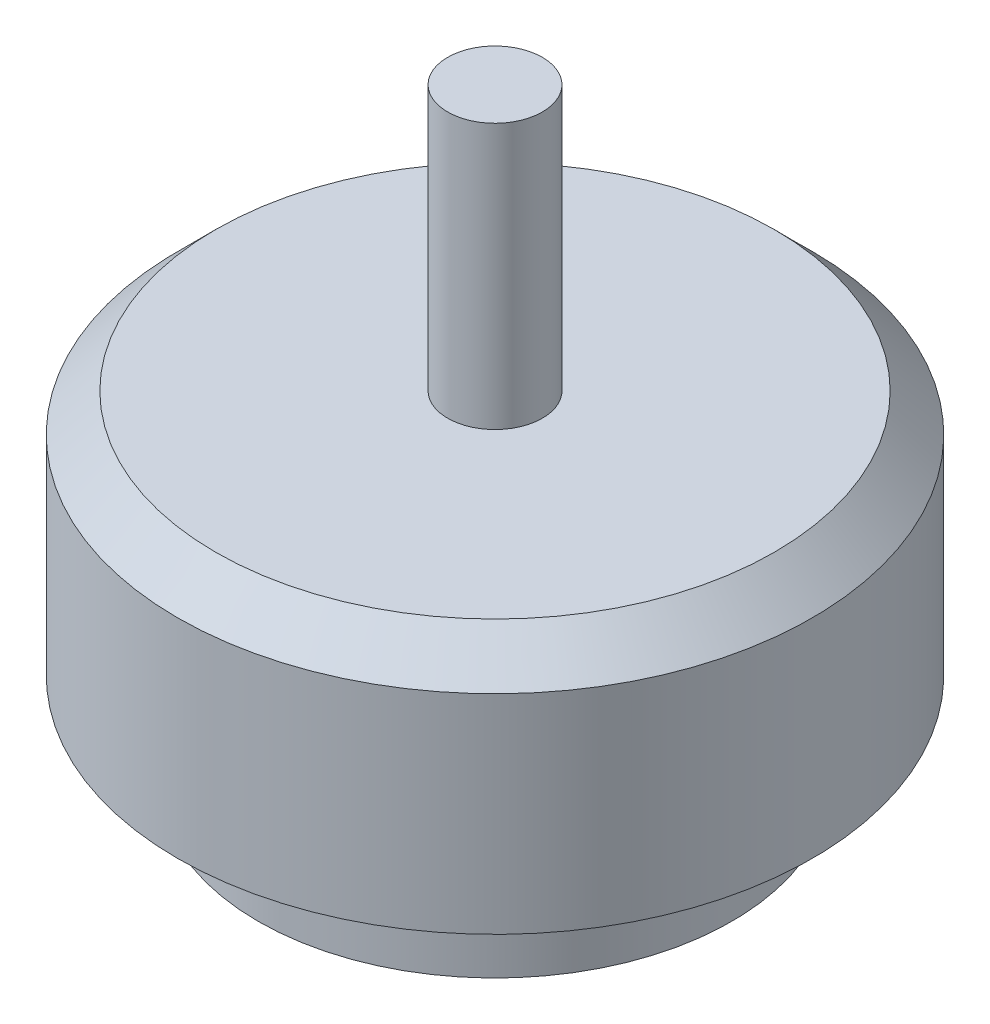
ISO-10303-21;
HEADER;
FILE_DESCRIPTION(('STEP AP214'),'2;1');
FILE_NAME('part.step','',(''),(''),'','','');
FILE_SCHEMA(('AUTOMOTIVE_DESIGN { 1 0 10303 214 1 1 1 1 }'));
ENDSEC;
DATA;
#1=APPLICATION_CONTEXT('core data for automotive mechanical design processes');
#2=APPLICATION_PROTOCOL_DEFINITION('international standard','automotive_design',2000,#1);
#3=PRODUCT_CONTEXT('',#1,'mechanical');
#4=PRODUCT('Part','Part','',(#3));
#5=PRODUCT_RELATED_PRODUCT_CATEGORY('part','',(#4));
#6=PRODUCT_DEFINITION_FORMATION('','',#4);
#7=PRODUCT_DEFINITION_CONTEXT('part definition',#1,'design');
#8=PRODUCT_DEFINITION('design','',#6,#7);
#9=PRODUCT_DEFINITION_SHAPE('','',#8);
#10=(LENGTH_UNIT() NAMED_UNIT(*) SI_UNIT(.MILLI.,.METRE.));
#11=(NAMED_UNIT(*) PLANE_ANGLE_UNIT() SI_UNIT($,.RADIAN.));
#12=(NAMED_UNIT(*) SI_UNIT($,.STERADIAN.) SOLID_ANGLE_UNIT());
#13=UNCERTAINTY_MEASURE_WITH_UNIT(LENGTH_MEASURE(1.E-05),#10,'distance_accuracy_value','');
#14=(GEOMETRIC_REPRESENTATION_CONTEXT(3) GLOBAL_UNCERTAINTY_ASSIGNED_CONTEXT((#13)) GLOBAL_UNIT_ASSIGNED_CONTEXT((#10,
#11,#12)) REPRESENTATION_CONTEXT('',''));
#15=CARTESIAN_POINT('',(0.,0.,0.));
#16=DIRECTION('',(0.,0.,1.));
#17=DIRECTION('',(1.,0.,0.));
#18=AXIS2_PLACEMENT_3D('',#15,#16,#17);
#19=CARTESIAN_POINT('',(0.,14.,0.));
#20=DIRECTION('',(0.,1.,0.));
#21=DIRECTION('',(0.,0.,1.));
#22=AXIS2_PLACEMENT_3D('',#19,#20,#21);
#23=PLANE('',#22);
#24=CARTESIAN_POINT('',(0.,14.,0.));
#25=DIRECTION('',(0.,-1.,0.));
#26=DIRECTION('',(0.,0.,-1.));
#27=AXIS2_PLACEMENT_3D('',#24,#25,#26);
#28=CIRCLE('',#27,2.5);
#29=CARTESIAN_POINT('',(0.,14.,-2.5));
#30=VERTEX_POINT('',#29);
#31=EDGE_CURVE('E57',#30,#30,#28,.T.);
#32=ORIENTED_EDGE('',*,*,#31,.F.);
#33=EDGE_LOOP('',(#32));
#34=FACE_BOUND('',#33,.T.);
#35=ADVANCED_FACE('F45',(#34),#23,.T.);
#36=CARTESIAN_POINT('',(0.,-18.,0.));
#37=DIRECTION('',(0.,-1.,0.));
#38=DIRECTION('',(0.,0.,-1.));
#39=AXIS2_PLACEMENT_3D('',#36,#37,#38);
#40=CYLINDRICAL_SURFACE('',#39,2.5);
#41=ORIENTED_EDGE('',*,*,#31,.T.);
#42=EDGE_LOOP('',(#41));
#43=FACE_BOUND('',#42,.T.);
#44=CARTESIAN_POINT('',(0.,0.,0.));
#45=DIRECTION('',(0.,-1.,0.));
#46=DIRECTION('',(0.,0.,-1.));
#47=AXIS2_PLACEMENT_3D('',#44,#45,#46);
#48=CIRCLE('',#47,2.5);
#49=CARTESIAN_POINT('',(0.,0.,-2.5));
#50=VERTEX_POINT('',#49);
#51=EDGE_CURVE('E61',#50,#50,#48,.T.);
#52=ORIENTED_EDGE('',*,*,#51,.F.);
#53=EDGE_LOOP('',(#52));
#54=FACE_BOUND('',#53,.T.);
#55=ADVANCED_FACE('F98',(#43,#54),#40,.T.);
#56=CARTESIAN_POINT('',(2.5,0.,0.));
#57=DIRECTION('',(0.,1.,0.));
#58=DIRECTION('',(0.,0.,1.));
#59=AXIS2_PLACEMENT_3D('',#56,#57,#58);
#60=PLANE('',#59);
#61=CARTESIAN_POINT('',(0.,0.,0.));
#62=DIRECTION('',(0.,1.,0.));
#63=DIRECTION('',(0.,0.,1.));
#64=AXIS2_PLACEMENT_3D('',#61,#62,#63);
#65=CIRCLE('',#64,14.75);
#66=CARTESIAN_POINT('',(0.,0.,14.75));
#67=VERTEX_POINT('',#66);
#68=EDGE_CURVE('E10',#67,#67,#65,.T.);
#69=ORIENTED_EDGE('',*,*,#68,.T.);
#70=EDGE_LOOP('',(#69));
#71=FACE_BOUND('',#70,.T.);
#72=ORIENTED_EDGE('',*,*,#51,.T.);
#73=EDGE_LOOP('',(#72));
#74=FACE_BOUND('',#73,.T.);
#75=ADVANCED_FACE('F103',(#71,#74),#60,.T.);
#76=CARTESIAN_POINT('',(0.,-18.,0.));
#77=DIRECTION('',(0.,-1.,0.));
#78=DIRECTION('',(0.,0.,-1.));
#79=AXIS2_PLACEMENT_3D('',#76,#77,#78);
#80=CYLINDRICAL_SURFACE('',#79,16.75);
#81=CARTESIAN_POINT('',(0.,-2.00000000000001,0.));
#82=DIRECTION('',(0.,1.,0.));
#83=DIRECTION('',(0.,0.,1.));
#84=AXIS2_PLACEMENT_3D('',#81,#82,#83);
#85=CIRCLE('',#84,16.75);
#86=CARTESIAN_POINT('',(0.,-2.00000000000001,16.75));
#87=VERTEX_POINT('',#86);
#88=EDGE_CURVE('E53',#87,#87,#85,.F.);
#89=ORIENTED_EDGE('',*,*,#88,.T.);
#90=EDGE_LOOP('',(#89));
#91=FACE_BOUND('',#90,.T.);
#92=CARTESIAN_POINT('',(0.,-13.,0.));
#93=DIRECTION('',(0.,-1.,0.));
#94=DIRECTION('',(0.,0.,-1.));
#95=AXIS2_PLACEMENT_3D('',#92,#93,#94);
#96=CIRCLE('',#95,16.75);
#97=CARTESIAN_POINT('',(0.,-13.,-16.75));
#98=VERTEX_POINT('',#97);
#99=EDGE_CURVE('E66',#98,#98,#96,.T.);
#100=ORIENTED_EDGE('',*,*,#99,.F.);
#101=EDGE_LOOP('',(#100));
#102=FACE_BOUND('',#101,.T.);
#103=ADVANCED_FACE('F110',(#91,#102),#80,.T.);
#104=CARTESIAN_POINT('',(16.75,-13.,0.));
#105=DIRECTION('',(0.,-1.,0.));
#106=DIRECTION('',(0.,0.,-1.));
#107=AXIS2_PLACEMENT_3D('',#104,#105,#106);
#108=PLANE('',#107);
#109=ORIENTED_EDGE('',*,*,#99,.T.);
#110=EDGE_LOOP('',(#109));
#111=FACE_BOUND('',#110,.T.);
#112=CARTESIAN_POINT('',(0.,-13.,0.));
#113=DIRECTION('',(0.,-1.,0.));
#114=DIRECTION('',(0.,0.,-1.));
#115=AXIS2_PLACEMENT_3D('',#112,#113,#114);
#116=CIRCLE('',#115,5.);
#117=CARTESIAN_POINT('',(0.,-13.,-5.));
#118=VERTEX_POINT('',#117);
#119=EDGE_CURVE('E69',#118,#118,#116,.T.);
#120=ORIENTED_EDGE('',*,*,#119,.F.);
#121=EDGE_LOOP('',(#120));
#122=FACE_BOUND('',#121,.T.);
#123=ADVANCED_FACE('F113',(#111,#122),#108,.T.);
#124=CARTESIAN_POINT('',(0.,-18.,0.));
#125=DIRECTION('',(0.,-1.,0.));
#126=DIRECTION('',(0.,0.,-1.));
#127=AXIS2_PLACEMENT_3D('',#124,#125,#126);
#128=CYLINDRICAL_SURFACE('',#127,5.);
#129=ORIENTED_EDGE('',*,*,#119,.T.);
#130=EDGE_LOOP('',(#129));
#131=FACE_BOUND('',#130,.T.);
#132=CARTESIAN_POINT('',(0.,-15.,0.));
#133=DIRECTION('',(0.,-1.,0.));
#134=DIRECTION('',(0.,0.,-1.));
#135=AXIS2_PLACEMENT_3D('',#132,#133,#134);
#136=CIRCLE('',#135,5.);
#137=CARTESIAN_POINT('',(0.,-15.,-5.));
#138=VERTEX_POINT('',#137);
#139=EDGE_CURVE('E72',#138,#138,#136,.T.);
#140=ORIENTED_EDGE('',*,*,#139,.F.);
#141=EDGE_LOOP('',(#140));
#142=FACE_BOUND('',#141,.T.);
#143=ADVANCED_FACE('F94',(#131,#142),#128,.T.);
#144=CARTESIAN_POINT('',(5.,-15.,0.));
#145=DIRECTION('',(0.,1.,0.));
#146=DIRECTION('',(0.,0.,1.));
#147=AXIS2_PLACEMENT_3D('',#144,#145,#146);
#148=PLANE('',#147);
#149=ORIENTED_EDGE('',*,*,#139,.T.);
#150=EDGE_LOOP('',(#149));
#151=FACE_BOUND('',#150,.T.);
#152=CARTESIAN_POINT('',(0.,-15.,0.));
#153=DIRECTION('',(0.,-1.,0.));
#154=DIRECTION('',(0.,0.,-1.));
#155=AXIS2_PLACEMENT_3D('',#152,#153,#154);
#156=CIRCLE('',#155,12.5);
#157=CARTESIAN_POINT('',(0.,-15.,-12.5));
#158=VERTEX_POINT('',#157);
#159=EDGE_CURVE('E75',#158,#158,#156,.T.);
#160=ORIENTED_EDGE('',*,*,#159,.F.);
#161=EDGE_LOOP('',(#160));
#162=FACE_BOUND('',#161,.T.);
#163=ADVANCED_FACE('F86',(#151,#162),#148,.T.);
#164=CARTESIAN_POINT('',(0.,-18.,0.));
#165=DIRECTION('',(0.,-1.,0.));
#166=DIRECTION('',(0.,0.,-1.));
#167=AXIS2_PLACEMENT_3D('',#164,#165,#166);
#168=CYLINDRICAL_SURFACE('',#167,12.5);
#169=ORIENTED_EDGE('',*,*,#159,.T.);
#170=EDGE_LOOP('',(#169));
#171=FACE_BOUND('',#170,.T.);
#172=CARTESIAN_POINT('',(0.,-18.,0.));
#173=DIRECTION('',(0.,-1.,0.));
#174=DIRECTION('',(0.,0.,-1.));
#175=AXIS2_PLACEMENT_3D('',#172,#173,#174);
#176=CIRCLE('',#175,12.5);
#177=CARTESIAN_POINT('',(0.,-18.,-12.5));
#178=VERTEX_POINT('',#177);
#179=EDGE_CURVE('E78',#178,#178,#176,.T.);
#180=ORIENTED_EDGE('',*,*,#179,.F.);
#181=EDGE_LOOP('',(#180));
#182=FACE_BOUND('',#181,.T.);
#183=ADVANCED_FACE('F84',(#171,#182),#168,.T.);
#184=CARTESIAN_POINT('',(12.5,-18.,0.));
#185=DIRECTION('',(0.,-1.,0.));
#186=DIRECTION('',(0.,0.,-1.));
#187=AXIS2_PLACEMENT_3D('',#184,#185,#186);
#188=PLANE('',#187);
#189=ORIENTED_EDGE('',*,*,#179,.T.);
#190=EDGE_LOOP('',(#189));
#191=FACE_BOUND('',#190,.T.);
#192=ADVANCED_FACE('F82',(#191),#188,.T.);
#193=CARTESIAN_POINT('',(0.,-2.00000000000001,0.));
#194=DIRECTION('',(0.,-1.,0.));
#195=DIRECTION('',(0.,0.,-1.));
#196=AXIS2_PLACEMENT_3D('',#193,#194,#195);
#197=CONICAL_SURFACE('',#196,16.75,0.78539816339745);
#198=ORIENTED_EDGE('',*,*,#68,.F.);
#199=EDGE_LOOP('',(#198));
#200=FACE_BOUND('',#199,.T.);
#201=ORIENTED_EDGE('',*,*,#88,.F.);
#202=EDGE_LOOP('',(#201));
#203=FACE_BOUND('',#202,.T.);
#204=ADVANCED_FACE('F48',(#200,#203),#197,.T.);
#205=CLOSED_SHELL('',(#35,#55,#75,#103,#123,#143,#163,#183,#192,#204));
#206=MANIFOLD_SOLID_BREP('B2',#205);
#207=ADVANCED_BREP_SHAPE_REPRESENTATION('',(#18,#206),#14);
#208=SHAPE_DEFINITION_REPRESENTATION(#9,#207);
ENDSEC;
END-ISO-10303-21;
